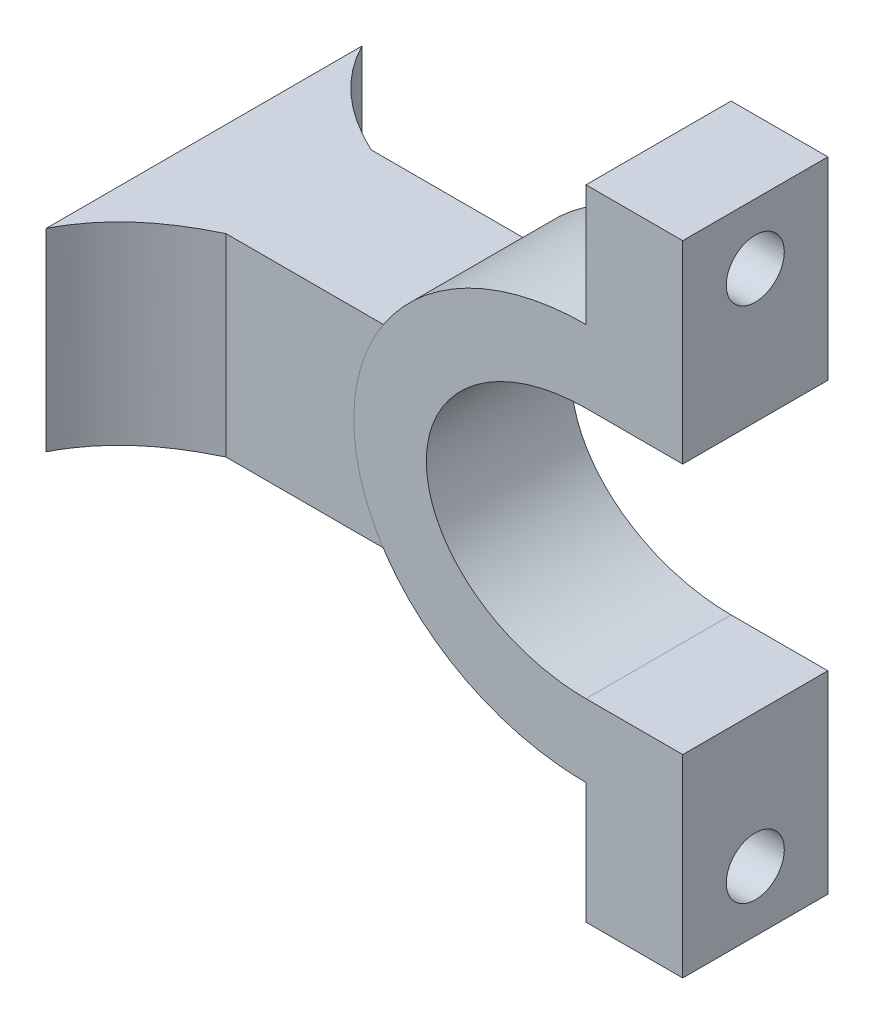
ISO-10303-21;
HEADER;
FILE_DESCRIPTION(('STEP AP214'),'2;1');
FILE_NAME('part.step','',(''),(''),'','','');
FILE_SCHEMA(('AUTOMOTIVE_DESIGN { 1 0 10303 214 1 1 1 1 }'));
ENDSEC;
DATA;
#1=APPLICATION_CONTEXT('core data for automotive mechanical design processes');
#2=APPLICATION_PROTOCOL_DEFINITION('international standard','automotive_design',2000,#1);
#3=PRODUCT_CONTEXT('',#1,'mechanical');
#4=PRODUCT('Part','Part','',(#3));
#5=PRODUCT_RELATED_PRODUCT_CATEGORY('part','',(#4));
#6=PRODUCT_DEFINITION_FORMATION('','',#4);
#7=PRODUCT_DEFINITION_CONTEXT('part definition',#1,'design');
#8=PRODUCT_DEFINITION('design','',#6,#7);
#9=PRODUCT_DEFINITION_SHAPE('','',#8);
#10=(LENGTH_UNIT() NAMED_UNIT(*) SI_UNIT(.MILLI.,.METRE.));
#11=(NAMED_UNIT(*) PLANE_ANGLE_UNIT() SI_UNIT($,.RADIAN.));
#12=(NAMED_UNIT(*) SI_UNIT($,.STERADIAN.) SOLID_ANGLE_UNIT());
#13=UNCERTAINTY_MEASURE_WITH_UNIT(LENGTH_MEASURE(1.E-05),#10,'distance_accuracy_value','');
#14=(GEOMETRIC_REPRESENTATION_CONTEXT(3) GLOBAL_UNCERTAINTY_ASSIGNED_CONTEXT((#13)) GLOBAL_UNIT_ASSIGNED_CONTEXT((#10,
#11,#12)) REPRESENTATION_CONTEXT('',''));
#15=CARTESIAN_POINT('',(0.,0.,0.));
#16=DIRECTION('',(0.,0.,1.));
#17=DIRECTION('',(1.,0.,0.));
#18=AXIS2_PLACEMENT_3D('',#15,#16,#17);
#19=CARTESIAN_POINT('',(-19.,9.99999999999999,-0.0273344769397017));
#20=DIRECTION('',(0.,0.,1.));
#21=DIRECTION('',(0.,-1.,0.));
#22=AXIS2_PLACEMENT_3D('',#19,#20,#21);
#23=PLANE('',#22);
#24=DIRECTION('',(0.,-1.,0.));
#25=VECTOR('',#24,1.);
#26=CARTESIAN_POINT('',(-37.2319884603769,9.99999999999999,-0.027334476939704));
#27=LINE('',#26,#25);
#28=CARTESIAN_POINT('',(-37.2319884603769,9.99999999999999,-0.0273344769397017));
#29=VERTEX_POINT('',#28);
#30=CARTESIAN_POINT('',(-37.2319884603769,-10.,-0.0273344769397063));
#31=VERTEX_POINT('',#30);
#32=EDGE_CURVE('E96',#29,#31,#27,.T.);
#33=ORIENTED_EDGE('',*,*,#32,.F.);
#34=DIRECTION('',(-1.,0.,0.));
#35=VECTOR('',#34,1.);
#36=CARTESIAN_POINT('',(-19.,9.99999999999999,-0.0273344769397017));
#37=LINE('',#36,#35);
#38=CARTESIAN_POINT('',(-19.,9.99999999999999,-0.0273344769397017));
#39=VERTEX_POINT('',#38);
#40=EDGE_CURVE('E378',#39,#29,#37,.T.);
#41=ORIENTED_EDGE('',*,*,#40,.F.);
#42=DIRECTION('',(0.,1.,0.));
#43=VECTOR('',#42,1.);
#44=CARTESIAN_POINT('',(-19.,9.99999999999999,-0.0273344769397017));
#45=LINE('',#44,#43);
#46=CARTESIAN_POINT('',(-19.,-10.,-0.0273344769397066));
#47=VERTEX_POINT('',#46);
#48=EDGE_CURVE('E369',#47,#39,#45,.T.);
#49=ORIENTED_EDGE('',*,*,#48,.F.);
#50=DIRECTION('',(-1.,0.,0.));
#51=VECTOR('',#50,1.);
#52=CARTESIAN_POINT('',(-19.,-10.,-0.0273344769397066));
#53=LINE('',#52,#51);
#54=EDGE_CURVE('E381',#47,#31,#53,.T.);
#55=ORIENTED_EDGE('',*,*,#54,.T.);
#56=EDGE_LOOP('',(#33,#41,#49,#55));
#57=FACE_BOUND('',#56,.T.);
#58=ADVANCED_FACE('F79',(#57),#23,.F.);
#59=CARTESIAN_POINT('',(0.,0.,15.));
#60=DIRECTION('',(0.,0.,1.));
#61=DIRECTION('',(1.,0.,0.));
#62=AXIS2_PLACEMENT_3D('',#59,#60,#61);
#63=ELLIPSE('',#62,24.,20.5);
#64=DIRECTION('',(0.,0.,-1.));
#65=VECTOR('',#64,1.);
#66=SURFACE_OF_LINEAR_EXTRUSION('',#63,#65);
#67=DIRECTION('',(0.,0.,-1.));
#68=VECTOR('',#67,1.);
#69=CARTESIAN_POINT('',(-20.9508645871297,-10.,15.));
#70=LINE('',#69,#68);
#71=CARTESIAN_POINT('',(-20.9508645871297,-10.,0.));
#72=VERTEX_POINT('',#71);
#73=CARTESIAN_POINT('',(-20.9508645871297,-10.,14.9726655230603));
#74=VERTEX_POINT('',#73);
#75=EDGE_CURVE('E392',#72,#74,#70,.F.);
#76=ORIENTED_EDGE('',*,*,#75,.F.);
#77=CARTESIAN_POINT('',(0.,0.,0.));
#78=DIRECTION('',(0.,0.,1.));
#79=DIRECTION('',(1.,0.,0.));
#80=AXIS2_PLACEMENT_3D('',#77,#78,#79);
#81=ELLIPSE('',#80,24.,20.5);
#82=CARTESIAN_POINT('',(0.,-20.5,0.));
#83=VERTEX_POINT('',#82);
#84=EDGE_CURVE('E395',#72,#83,#81,.T.);
#85=ORIENTED_EDGE('',*,*,#84,.T.);
#86=DIRECTION('',(0.,0.,-1.));
#87=VECTOR('',#86,1.);
#88=CARTESIAN_POINT('',(0.,-20.5,15.));
#89=LINE('',#88,#87);
#90=CARTESIAN_POINT('',(0.,-20.5,15.));
#91=VERTEX_POINT('',#90);
#92=EDGE_CURVE('E483',#91,#83,#89,.T.);
#93=ORIENTED_EDGE('',*,*,#92,.F.);
#94=CARTESIAN_POINT('',(0.,20.5,15.));
#95=VERTEX_POINT('',#94);
#96=EDGE_CURVE('E396',#95,#91,#63,.T.);
#97=ORIENTED_EDGE('',*,*,#96,.F.);
#98=DIRECTION('',(0.,0.,-1.));
#99=VECTOR('',#98,1.);
#100=CARTESIAN_POINT('',(0.,20.5,15.));
#101=LINE('',#100,#99);
#102=CARTESIAN_POINT('',(0.,20.5,0.));
#103=VERTEX_POINT('',#102);
#104=EDGE_CURVE('E490',#95,#103,#101,.T.);
#105=ORIENTED_EDGE('',*,*,#104,.T.);
#106=CARTESIAN_POINT('',(-20.9508645871297,9.99999999999999,0.));
#107=VERTEX_POINT('',#106);
#108=EDGE_CURVE('E407',#103,#107,#81,.T.);
#109=ORIENTED_EDGE('',*,*,#108,.T.);
#110=DIRECTION('',(0.,0.,-1.));
#111=VECTOR('',#110,1.);
#112=CARTESIAN_POINT('',(-20.9508645871297,9.99999999999999,15.));
#113=LINE('',#112,#111);
#114=CARTESIAN_POINT('',(-20.9508645871297,9.99999999999999,14.9726655230603));
#115=VERTEX_POINT('',#114);
#116=EDGE_CURVE('E388',#115,#107,#113,.T.);
#117=ORIENTED_EDGE('',*,*,#116,.F.);
#118=CARTESIAN_POINT('',(0.,0.,14.9726655230603));
#119=DIRECTION('',(0.,0.,1.));
#120=DIRECTION('',(1.,0.,0.));
#121=AXIS2_PLACEMENT_3D('',#118,#119,#120);
#122=ELLIPSE('',#121,24.,20.5);
#123=EDGE_CURVE('E12',#74,#115,#122,.F.);
#124=ORIENTED_EDGE('',*,*,#123,.F.);
#125=EDGE_LOOP('',(#76,#85,#93,#97,#105,#109,#117,#124));
#126=FACE_BOUND('',#125,.T.);
#127=ADVANCED_FACE('F81',(#126),#66,.F.);
#128=CARTESIAN_POINT('',(0.,0.,0.));
#129=DIRECTION('',(0.,0.,1.));
#130=DIRECTION('',(1.,0.,0.));
#131=AXIS2_PLACEMENT_3D('',#128,#129,#130);
#132=PLANE('',#131);
#133=DIRECTION('',(-1.,0.,0.));
#134=VECTOR('',#133,1.);
#135=CARTESIAN_POINT('',(0.,-10.,0.));
#136=LINE('',#135,#134);
#137=CARTESIAN_POINT('',(-19.,-10.,0.));
#138=VERTEX_POINT('',#137);
#139=EDGE_CURVE('E89',#138,#72,#136,.T.);
#140=ORIENTED_EDGE('',*,*,#139,.F.);
#141=DIRECTION('',(0.,-1.,0.));
#142=VECTOR('',#141,1.);
#143=CARTESIAN_POINT('',(-19.,0.,0.));
#144=LINE('',#143,#142);
#145=CARTESIAN_POINT('',(-19.,9.99999999999999,0.));
#146=VERTEX_POINT('',#145);
#147=EDGE_CURVE('E496',#146,#138,#144,.T.);
#148=ORIENTED_EDGE('',*,*,#147,.F.);
#149=DIRECTION('',(1.,0.,0.));
#150=VECTOR('',#149,1.);
#151=CARTESIAN_POINT('',(0.,9.99999999999999,0.));
#152=LINE('',#151,#150);
#153=EDGE_CURVE('E501',#107,#146,#152,.T.);
#154=ORIENTED_EDGE('',*,*,#153,.F.);
#155=ORIENTED_EDGE('',*,*,#108,.F.);
#156=DIRECTION('',(0.,1.,0.));
#157=VECTOR('',#156,1.);
#158=CARTESIAN_POINT('',(0.,13.,0.));
#159=LINE('',#158,#157);
#160=CARTESIAN_POINT('',(0.,33.,0.));
#161=VERTEX_POINT('',#160);
#162=EDGE_CURVE('E307',#103,#161,#159,.T.);
#163=ORIENTED_EDGE('',*,*,#162,.T.);
#164=DIRECTION('',(-1.,0.,0.));
#165=VECTOR('',#164,1.);
#166=CARTESIAN_POINT('',(10.,33.,0.));
#167=LINE('',#166,#165);
#168=CARTESIAN_POINT('',(10.,33.,0.));
#169=VERTEX_POINT('',#168);
#170=EDGE_CURVE('E316',#169,#161,#167,.T.);
#171=ORIENTED_EDGE('',*,*,#170,.F.);
#172=DIRECTION('',(0.,1.,0.));
#173=VECTOR('',#172,1.);
#174=CARTESIAN_POINT('',(10.,13.,0.));
#175=LINE('',#174,#173);
#176=CARTESIAN_POINT('',(10.,13.,0.));
#177=VERTEX_POINT('',#176);
#178=EDGE_CURVE('E296',#177,#169,#175,.T.);
#179=ORIENTED_EDGE('',*,*,#178,.F.);
#180=DIRECTION('',(-1.,0.,0.));
#181=VECTOR('',#180,1.);
#182=CARTESIAN_POINT('',(10.,13.,0.));
#183=LINE('',#182,#181);
#184=CARTESIAN_POINT('',(0.,13.,0.));
#185=VERTEX_POINT('',#184);
#186=EDGE_CURVE('E320',#177,#185,#183,.T.);
#187=ORIENTED_EDGE('',*,*,#186,.T.);
#188=CARTESIAN_POINT('',(0.,0.,0.));
#189=DIRECTION('',(0.,0.,1.));
#190=DIRECTION('',(1.,0.,0.));
#191=AXIS2_PLACEMENT_3D('',#188,#189,#190);
#192=ELLIPSE('',#191,16.5,13.);
#193=CARTESIAN_POINT('',(0.,-13.,0.));
#194=VERTEX_POINT('',#193);
#195=EDGE_CURVE('E402',#185,#194,#192,.T.);
#196=ORIENTED_EDGE('',*,*,#195,.T.);
#197=DIRECTION('',(-1.,0.,0.));
#198=VECTOR('',#197,1.);
#199=CARTESIAN_POINT('',(10.,-13.,0.));
#200=LINE('',#199,#198);
#201=CARTESIAN_POINT('',(10.,-13.,0.));
#202=VERTEX_POINT('',#201);
#203=EDGE_CURVE('E335',#202,#194,#200,.T.);
#204=ORIENTED_EDGE('',*,*,#203,.F.);
#205=DIRECTION('',(0.,1.,0.));
#206=VECTOR('',#205,1.);
#207=CARTESIAN_POINT('',(10.,-13.,0.));
#208=LINE('',#207,#206);
#209=CARTESIAN_POINT('',(10.,-33.,0.));
#210=VERTEX_POINT('',#209);
#211=EDGE_CURVE('E356',#210,#202,#208,.T.);
#212=ORIENTED_EDGE('',*,*,#211,.F.);
#213=DIRECTION('',(-1.,0.,0.));
#214=VECTOR('',#213,1.);
#215=CARTESIAN_POINT('',(10.,-33.,0.));
#216=LINE('',#215,#214);
#217=CARTESIAN_POINT('',(0.,-33.,0.));
#218=VERTEX_POINT('',#217);
#219=EDGE_CURVE('E331',#210,#218,#216,.T.);
#220=ORIENTED_EDGE('',*,*,#219,.T.);
#221=DIRECTION('',(0.,1.,0.));
#222=VECTOR('',#221,1.);
#223=CARTESIAN_POINT('',(0.,-13.,0.));
#224=LINE('',#223,#222);
#225=EDGE_CURVE('E344',#218,#83,#224,.T.);
#226=ORIENTED_EDGE('',*,*,#225,.T.);
#227=ORIENTED_EDGE('',*,*,#84,.F.);
#228=EDGE_LOOP('',(#140,#148,#154,#155,#163,#171,#179,#187,#196,#204,#212,#220,#226,#227));
#229=FACE_BOUND('',#228,.T.);
#230=ADVANCED_FACE('F413',(#229),#132,.F.);
#231=CARTESIAN_POINT('',(0.,0.,15.));
#232=DIRECTION('',(0.,0.,1.));
#233=DIRECTION('',(1.,0.,0.));
#234=AXIS2_PLACEMENT_3D('',#231,#232,#233);
#235=ELLIPSE('',#234,16.5,13.);
#236=DIRECTION('',(0.,0.,-1.));
#237=VECTOR('',#236,1.);
#238=SURFACE_OF_LINEAR_EXTRUSION('',#235,#237);
#239=ORIENTED_EDGE('',*,*,#195,.F.);
#240=DIRECTION('',(0.,0.,-1.));
#241=VECTOR('',#240,1.);
#242=CARTESIAN_POINT('',(0.,13.,15.));
#243=LINE('',#242,#241);
#244=CARTESIAN_POINT('',(0.,13.,15.));
#245=VERTEX_POINT('',#244);
#246=EDGE_CURVE('E406',#245,#185,#243,.T.);
#247=ORIENTED_EDGE('',*,*,#246,.F.);
#248=CARTESIAN_POINT('',(0.,-13.,15.));
#249=VERTEX_POINT('',#248);
#250=EDGE_CURVE('E401',#245,#249,#235,.T.);
#251=ORIENTED_EDGE('',*,*,#250,.T.);
#252=DIRECTION('',(0.,0.,-1.));
#253=VECTOR('',#252,1.);
#254=CARTESIAN_POINT('',(0.,-13.,15.));
#255=LINE('',#254,#253);
#256=EDGE_CURVE('E503',#249,#194,#255,.T.);
#257=ORIENTED_EDGE('',*,*,#256,.T.);
#258=EDGE_LOOP('',(#239,#247,#251,#257));
#259=FACE_BOUND('',#258,.T.);
#260=ADVANCED_FACE('F409',(#259),#238,.T.);
#261=CARTESIAN_POINT('',(0.,0.,15.));
#262=DIRECTION('',(0.,0.,1.));
#263=DIRECTION('',(1.,0.,0.));
#264=AXIS2_PLACEMENT_3D('',#261,#262,#263);
#265=PLANE('',#264);
#266=ORIENTED_EDGE('',*,*,#250,.F.);
#267=DIRECTION('',(-1.,0.,0.));
#268=VECTOR('',#267,1.);
#269=CARTESIAN_POINT('',(10.,13.,15.));
#270=LINE('',#269,#268);
#271=CARTESIAN_POINT('',(10.,13.,15.));
#272=VERTEX_POINT('',#271);
#273=EDGE_CURVE('E324',#272,#245,#270,.T.);
#274=ORIENTED_EDGE('',*,*,#273,.F.);
#275=DIRECTION('',(0.,-1.,0.));
#276=VECTOR('',#275,1.);
#277=CARTESIAN_POINT('',(10.,13.,15.));
#278=LINE('',#277,#276);
#279=CARTESIAN_POINT('',(10.,33.,15.));
#280=VERTEX_POINT('',#279);
#281=EDGE_CURVE('E288',#280,#272,#278,.T.);
#282=ORIENTED_EDGE('',*,*,#281,.F.);
#283=DIRECTION('',(-1.,0.,0.));
#284=VECTOR('',#283,1.);
#285=CARTESIAN_POINT('',(10.,33.,15.));
#286=LINE('',#285,#284);
#287=CARTESIAN_POINT('',(0.,33.,15.));
#288=VERTEX_POINT('',#287);
#289=EDGE_CURVE('E302',#280,#288,#286,.T.);
#290=ORIENTED_EDGE('',*,*,#289,.T.);
#291=DIRECTION('',(0.,-1.,0.));
#292=VECTOR('',#291,1.);
#293=CARTESIAN_POINT('',(0.,13.,15.));
#294=LINE('',#293,#292);
#295=EDGE_CURVE('E303',#288,#95,#294,.T.);
#296=ORIENTED_EDGE('',*,*,#295,.T.);
#297=ORIENTED_EDGE('',*,*,#96,.T.);
#298=DIRECTION('',(0.,-1.,0.));
#299=VECTOR('',#298,1.);
#300=CARTESIAN_POINT('',(0.,-13.,15.));
#301=LINE('',#300,#299);
#302=CARTESIAN_POINT('',(0.,-33.,15.));
#303=VERTEX_POINT('',#302);
#304=EDGE_CURVE('E308',#91,#303,#301,.T.);
#305=ORIENTED_EDGE('',*,*,#304,.T.);
#306=DIRECTION('',(-1.,0.,0.));
#307=VECTOR('',#306,1.);
#308=CARTESIAN_POINT('',(10.,-33.,15.));
#309=LINE('',#308,#307);
#310=CARTESIAN_POINT('',(10.,-33.,15.));
#311=VERTEX_POINT('',#310);
#312=EDGE_CURVE('E276',#311,#303,#309,.T.);
#313=ORIENTED_EDGE('',*,*,#312,.F.);
#314=DIRECTION('',(0.,-1.,0.));
#315=VECTOR('',#314,1.);
#316=CARTESIAN_POINT('',(10.,-13.,15.));
#317=LINE('',#316,#315);
#318=CARTESIAN_POINT('',(10.,-13.,15.));
#319=VERTEX_POINT('',#318);
#320=EDGE_CURVE('E349',#319,#311,#317,.T.);
#321=ORIENTED_EDGE('',*,*,#320,.F.);
#322=DIRECTION('',(-1.,0.,0.));
#323=VECTOR('',#322,1.);
#324=CARTESIAN_POINT('',(10.,-13.,15.));
#325=LINE('',#324,#323);
#326=EDGE_CURVE('E339',#319,#249,#325,.T.);
#327=ORIENTED_EDGE('',*,*,#326,.T.);
#328=EDGE_LOOP('',(#266,#274,#282,#290,#296,#297,#305,#313,#321,#327));
#329=FACE_BOUND('',#328,.T.);
#330=ADVANCED_FACE('F412',(#329),#265,.T.);
#331=CARTESIAN_POINT('',(-19.,-10.,-0.0273344769397066));
#332=DIRECTION('',(0.,1.,0.));
#333=DIRECTION('',(0.,0.,1.));
#334=AXIS2_PLACEMENT_3D('',#331,#332,#333);
#335=PLANE('',#334);
#336=ORIENTED_EDGE('',*,*,#139,.T.);
#337=ORIENTED_EDGE('',*,*,#75,.T.);
#338=DIRECTION('',(-1.,0.,0.));
#339=VECTOR('',#338,1.);
#340=CARTESIAN_POINT('',(-19.,-10.,14.9726655230603));
#341=LINE('',#340,#339);
#342=CARTESIAN_POINT('',(-37.2319884603769,-10.,14.9726655230603));
#343=VERTEX_POINT('',#342);
#344=EDGE_CURVE('E384',#74,#343,#341,.T.);
#345=ORIENTED_EDGE('',*,*,#344,.T.);
#346=CARTESIAN_POINT('',(-37.2319884603769,-10.,14.9726655230603));
#347=CARTESIAN_POINT('',(-40.110917996488,-10.,16.3725717447818));
#348=CARTESIAN_POINT('',(-44.4141664805553,-10.,18.7815693102138));
#349=CARTESIAN_POINT('',(-47.,-10.,23.7948089840785));
#350=B_SPLINE_CURVE_WITH_KNOTS('',3,(#346,#347,#348,#349),.UNSPECIFIED.,.F.,.F.,(4,4),(0.,1.),.UNSPECIFIED.);
#351=CARTESIAN_POINT('',(-47.,-10.,23.7948089840785));
#352=VERTEX_POINT('',#351);
#353=EDGE_CURVE('E233',#343,#352,#350,.T.);
#354=ORIENTED_EDGE('',*,*,#353,.T.);
#355=DIRECTION('',(0.,0.,-1.));
#356=VECTOR('',#355,1.);
#357=CARTESIAN_POINT('',(-47.,-10.,-0.0273344769397066));
#358=LINE('',#357,#356);
#359=CARTESIAN_POINT('',(-47.,-10.,-8.84947793795789));
#360=VERTEX_POINT('',#359);
#361=EDGE_CURVE('E219',#352,#360,#358,.T.);
#362=ORIENTED_EDGE('',*,*,#361,.T.);
#363=CARTESIAN_POINT('',(-47.,-10.,-8.84947793795789));
#364=CARTESIAN_POINT('',(-44.4141664805553,-10.,-3.83623826409321));
#365=CARTESIAN_POINT('',(-40.110917996488,-10.,-1.4272406986612));
#366=CARTESIAN_POINT('',(-37.2319884603769,-10.,-0.0273344769397063));
#367=B_SPLINE_CURVE_WITH_KNOTS('',3,(#363,#364,#365,#366),.UNSPECIFIED.,.F.,.F.,(4,4),(0.,1.),.UNSPECIFIED.);
#368=EDGE_CURVE('E238',#360,#31,#367,.T.);
#369=ORIENTED_EDGE('',*,*,#368,.T.);
#370=ORIENTED_EDGE('',*,*,#54,.F.);
#371=DIRECTION('',(0.,0.,-1.));
#372=VECTOR('',#371,1.);
#373=CARTESIAN_POINT('',(-19.,-10.,-0.0273344769397066));
#374=LINE('',#373,#372);
#375=EDGE_CURVE('E218',#138,#47,#374,.T.);
#376=ORIENTED_EDGE('',*,*,#375,.F.);
#377=EDGE_LOOP('',(#336,#337,#345,#354,#362,#369,#370,#376));
#378=FACE_BOUND('',#377,.T.);
#379=ADVANCED_FACE('F420',(#378),#335,.F.);
#380=CARTESIAN_POINT('',(-19.,9.99999999999999,-0.0273344769397017));
#381=DIRECTION('',(0.,-1.,0.));
#382=DIRECTION('',(0.,0.,-1.));
#383=AXIS2_PLACEMENT_3D('',#380,#381,#382);
#384=PLANE('',#383);
#385=DIRECTION('',(-1.,0.,0.));
#386=VECTOR('',#385,1.);
#387=CARTESIAN_POINT('',(-19.,9.99999999999999,14.9726655230603));
#388=LINE('',#387,#386);
#389=CARTESIAN_POINT('',(-37.2319884603769,9.99999999999999,14.9726655230603));
#390=VERTEX_POINT('',#389);
#391=EDGE_CURVE('E103',#115,#390,#388,.T.);
#392=ORIENTED_EDGE('',*,*,#391,.F.);
#393=ORIENTED_EDGE('',*,*,#116,.T.);
#394=ORIENTED_EDGE('',*,*,#153,.T.);
#395=DIRECTION('',(0.,0.,1.));
#396=VECTOR('',#395,1.);
#397=CARTESIAN_POINT('',(-19.,9.99999999999999,-0.0273344769397017));
#398=LINE('',#397,#396);
#399=EDGE_CURVE('E372',#39,#146,#398,.T.);
#400=ORIENTED_EDGE('',*,*,#399,.F.);
#401=ORIENTED_EDGE('',*,*,#40,.T.);
#402=CARTESIAN_POINT('',(-47.,9.99999999999999,-8.84947793795789));
#403=CARTESIAN_POINT('',(-44.4141664805553,9.99999999999999,-3.8362382640932));
#404=CARTESIAN_POINT('',(-40.110917996488,9.99999999999999,-1.4272406986612));
#405=CARTESIAN_POINT('',(-37.2319884603769,9.99999999999999,-0.027334476939704));
#406=B_SPLINE_CURVE_WITH_KNOTS('',3,(#402,#403,#404,#405),.UNSPECIFIED.,.F.,.F.,(4,4),(0.,1.),.UNSPECIFIED.);
#407=CARTESIAN_POINT('',(-47.,9.99999999999999,-8.84947793795789));
#408=VERTEX_POINT('',#407);
#409=EDGE_CURVE('E213',#408,#29,#406,.T.);
#410=ORIENTED_EDGE('',*,*,#409,.F.);
#411=DIRECTION('',(0.,0.,1.));
#412=VECTOR('',#411,1.);
#413=CARTESIAN_POINT('',(-47.,9.99999999999999,-0.0273344769397017));
#414=LINE('',#413,#412);
#415=CARTESIAN_POINT('',(-47.,9.99999999999999,23.7948089840785));
#416=VERTEX_POINT('',#415);
#417=EDGE_CURVE('E207',#408,#416,#414,.T.);
#418=ORIENTED_EDGE('',*,*,#417,.T.);
#419=CARTESIAN_POINT('',(-37.2319884603769,9.99999999999999,14.9726655230603));
#420=CARTESIAN_POINT('',(-40.110917996488,9.99999999999999,16.3725717447818));
#421=CARTESIAN_POINT('',(-44.4141664805553,9.99999999999999,18.7815693102138));
#422=CARTESIAN_POINT('',(-47.,9.99999999999999,23.7948089840785));
#423=B_SPLINE_CURVE_WITH_KNOTS('',3,(#419,#420,#421,#422),.UNSPECIFIED.,.F.,.F.,(4,4),(0.,1.),.UNSPECIFIED.);
#424=EDGE_CURVE('E211',#390,#416,#423,.T.);
#425=ORIENTED_EDGE('',*,*,#424,.F.);
#426=EDGE_LOOP('',(#392,#393,#394,#400,#401,#410,#418,#425));
#427=FACE_BOUND('',#426,.T.);
#428=ADVANCED_FACE('F209',(#427),#384,.F.);
#429=CARTESIAN_POINT('',(-19.,0.,0.));
#430=DIRECTION('',(-1.,0.,0.));
#431=DIRECTION('',(0.,0.,1.));
#432=AXIS2_PLACEMENT_3D('',#429,#430,#431);
#433=PLANE('',#432);
#434=ORIENTED_EDGE('',*,*,#399,.T.);
#435=ORIENTED_EDGE('',*,*,#147,.T.);
#436=ORIENTED_EDGE('',*,*,#375,.T.);
#437=ORIENTED_EDGE('',*,*,#48,.T.);
#438=EDGE_LOOP('',(#434,#435,#436,#437));
#439=FACE_BOUND('',#438,.T.);
#440=ADVANCED_FACE('F425',(#439),#433,.F.);
#441=CARTESIAN_POINT('',(-19.,9.99999999999999,14.9726655230603));
#442=DIRECTION('',(0.,0.,-1.));
#443=DIRECTION('',(0.,1.,0.));
#444=AXIS2_PLACEMENT_3D('',#441,#442,#443);
#445=PLANE('',#444);
#446=ORIENTED_EDGE('',*,*,#391,.T.);
#447=DIRECTION('',(0.,-1.,0.));
#448=VECTOR('',#447,1.);
#449=CARTESIAN_POINT('',(-37.2319884603769,9.99999999999999,14.9726655230603));
#450=LINE('',#449,#448);
#451=EDGE_CURVE('E229',#390,#343,#450,.T.);
#452=ORIENTED_EDGE('',*,*,#451,.T.);
#453=ORIENTED_EDGE('',*,*,#344,.F.);
#454=ORIENTED_EDGE('',*,*,#123,.T.);
#455=EDGE_LOOP('',(#446,#452,#453,#454));
#456=FACE_BOUND('',#455,.T.);
#457=ADVANCED_FACE('F422',(#456),#445,.F.);
#458=CARTESIAN_POINT('',(-47.,0.,0.));
#459=DIRECTION('',(-1.,0.,0.));
#460=DIRECTION('',(0.,0.,1.));
#461=AXIS2_PLACEMENT_3D('',#458,#459,#460);
#462=PLANE('',#461);
#463=ORIENTED_EDGE('',*,*,#361,.F.);
#464=DIRECTION('',(0.,-1.,0.));
#465=VECTOR('',#464,1.);
#466=CARTESIAN_POINT('',(-47.,9.99999999999999,23.7948089840785));
#467=LINE('',#466,#465);
#468=EDGE_CURVE('E222',#416,#352,#467,.T.);
#469=ORIENTED_EDGE('',*,*,#468,.F.);
#470=ORIENTED_EDGE('',*,*,#417,.F.);
#471=DIRECTION('',(0.,-1.,0.));
#472=VECTOR('',#471,1.);
#473=CARTESIAN_POINT('',(-47.,9.99999999999999,-8.84947793795789));
#474=LINE('',#473,#472);
#475=EDGE_CURVE('E265',#408,#360,#474,.T.);
#476=ORIENTED_EDGE('',*,*,#475,.T.);
#477=EDGE_LOOP('',(#463,#469,#470,#476));
#478=FACE_BOUND('',#477,.T.);
#479=ADVANCED_FACE('F223',(#478),#462,.T.);
#480=CARTESIAN_POINT('',(0.,0.,0.));
#481=DIRECTION('',(1.,0.,0.));
#482=DIRECTION('',(0.,1.,0.));
#483=AXIS2_PLACEMENT_3D('',#480,#481,#482);
#484=PLANE('',#483);
#485=CARTESIAN_POINT('',(0.,-26.75,7.49999999999996));
#486=DIRECTION('',(-1.,0.,0.));
#487=DIRECTION('',(0.,1.,0.));
#488=AXIS2_PLACEMENT_3D('',#485,#486,#487);
#489=CIRCLE('',#488,3.);
#490=CARTESIAN_POINT('',(0.,-23.75,7.49999999999996));
#491=VERTEX_POINT('',#490);
#492=EDGE_CURVE('E281',#491,#491,#489,.T.);
#493=ORIENTED_EDGE('',*,*,#492,.F.);
#494=EDGE_LOOP('',(#493));
#495=FACE_BOUND('',#494,.T.);
#496=ORIENTED_EDGE('',*,*,#304,.F.);
#497=ORIENTED_EDGE('',*,*,#92,.T.);
#498=ORIENTED_EDGE('',*,*,#225,.F.);
#499=DIRECTION('',(0.,0.,-1.));
#500=VECTOR('',#499,1.);
#501=CARTESIAN_POINT('',(0.,-33.,15.));
#502=LINE('',#501,#500);
#503=EDGE_CURVE('E348',#303,#218,#502,.T.);
#504=ORIENTED_EDGE('',*,*,#503,.F.);
#505=EDGE_LOOP('',(#496,#497,#498,#504));
#506=FACE_BOUND('',#505,.T.);
#507=ADVANCED_FACE('F438',(#495,#506),#484,.F.);
#508=CARTESIAN_POINT('',(10.,-33.,15.));
#509=DIRECTION('',(0.,1.,0.));
#510=DIRECTION('',(0.,0.,1.));
#511=AXIS2_PLACEMENT_3D('',#508,#509,#510);
#512=PLANE('',#511);
#513=ORIENTED_EDGE('',*,*,#503,.T.);
#514=ORIENTED_EDGE('',*,*,#219,.F.);
#515=DIRECTION('',(0.,0.,-1.));
#516=VECTOR('',#515,1.);
#517=CARTESIAN_POINT('',(10.,-33.,15.));
#518=LINE('',#517,#516);
#519=EDGE_CURVE('E359',#311,#210,#518,.T.);
#520=ORIENTED_EDGE('',*,*,#519,.F.);
#521=ORIENTED_EDGE('',*,*,#312,.T.);
#522=EDGE_LOOP('',(#513,#514,#520,#521));
#523=FACE_BOUND('',#522,.T.);
#524=ADVANCED_FACE('F447',(#523),#512,.F.);
#525=CARTESIAN_POINT('',(10.,-13.,15.));
#526=DIRECTION('',(0.,-1.,0.));
#527=DIRECTION('',(0.,0.,-1.));
#528=AXIS2_PLACEMENT_3D('',#525,#526,#527);
#529=PLANE('',#528);
#530=ORIENTED_EDGE('',*,*,#256,.F.);
#531=ORIENTED_EDGE('',*,*,#326,.F.);
#532=DIRECTION('',(0.,0.,1.));
#533=VECTOR('',#532,1.);
#534=CARTESIAN_POINT('',(10.,-13.,15.));
#535=LINE('',#534,#533);
#536=EDGE_CURVE('E343',#202,#319,#535,.T.);
#537=ORIENTED_EDGE('',*,*,#536,.F.);
#538=ORIENTED_EDGE('',*,*,#203,.T.);
#539=EDGE_LOOP('',(#530,#531,#537,#538));
#540=FACE_BOUND('',#539,.T.);
#541=ADVANCED_FACE('F443',(#540),#529,.F.);
#542=CARTESIAN_POINT('',(10.,0.,0.));
#543=DIRECTION('',(1.,0.,0.));
#544=DIRECTION('',(0.,1.,0.));
#545=AXIS2_PLACEMENT_3D('',#542,#543,#544);
#546=PLANE('',#545);
#547=CARTESIAN_POINT('',(10.,-26.75,7.49999999999996));
#548=DIRECTION('',(-1.,0.,0.));
#549=DIRECTION('',(0.,1.,0.));
#550=AXIS2_PLACEMENT_3D('',#547,#548,#549);
#551=CIRCLE('',#550,3.);
#552=CARTESIAN_POINT('',(10.,-23.75,7.49999999999996));
#553=VERTEX_POINT('',#552);
#554=EDGE_CURVE('E228',#553,#553,#551,.T.);
#555=ORIENTED_EDGE('',*,*,#554,.T.);
#556=EDGE_LOOP('',(#555));
#557=FACE_BOUND('',#556,.T.);
#558=ORIENTED_EDGE('',*,*,#320,.T.);
#559=ORIENTED_EDGE('',*,*,#519,.T.);
#560=ORIENTED_EDGE('',*,*,#211,.T.);
#561=ORIENTED_EDGE('',*,*,#536,.T.);
#562=EDGE_LOOP('',(#558,#559,#560,#561));
#563=FACE_BOUND('',#562,.T.);
#564=ADVANCED_FACE('F439',(#557,#563),#546,.T.);
#565=CARTESIAN_POINT('',(0.,0.,0.));
#566=DIRECTION('',(-1.,0.,0.));
#567=DIRECTION('',(0.,-1.,0.));
#568=AXIS2_PLACEMENT_3D('',#565,#566,#567);
#569=PLANE('',#568);
#570=CARTESIAN_POINT('',(0.,26.75,7.5));
#571=DIRECTION('',(-1.,0.,0.));
#572=DIRECTION('',(0.,-1.,0.));
#573=AXIS2_PLACEMENT_3D('',#570,#571,#572);
#574=CIRCLE('',#573,3.);
#575=CARTESIAN_POINT('',(0.,23.75,7.5));
#576=VERTEX_POINT('',#575);
#577=EDGE_CURVE('E277',#576,#576,#574,.T.);
#578=ORIENTED_EDGE('',*,*,#577,.F.);
#579=EDGE_LOOP('',(#578));
#580=FACE_BOUND('',#579,.T.);
#581=ORIENTED_EDGE('',*,*,#104,.F.);
#582=ORIENTED_EDGE('',*,*,#295,.F.);
#583=DIRECTION('',(0.,0.,1.));
#584=VECTOR('',#583,1.);
#585=CARTESIAN_POINT('',(0.,33.,15.));
#586=LINE('',#585,#584);
#587=EDGE_CURVE('E293',#161,#288,#586,.T.);
#588=ORIENTED_EDGE('',*,*,#587,.F.);
#589=ORIENTED_EDGE('',*,*,#162,.F.);
#590=EDGE_LOOP('',(#581,#582,#588,#589));
#591=FACE_BOUND('',#590,.T.);
#592=ADVANCED_FACE('F442',(#580,#591),#569,.T.);
#593=CARTESIAN_POINT('',(10.,13.,15.));
#594=DIRECTION('',(0.,1.,0.));
#595=DIRECTION('',(-1.,0.,0.));
#596=AXIS2_PLACEMENT_3D('',#593,#594,#595);
#597=PLANE('',#596);
#598=ORIENTED_EDGE('',*,*,#246,.T.);
#599=ORIENTED_EDGE('',*,*,#186,.F.);
#600=DIRECTION('',(0.,0.,-1.));
#601=VECTOR('',#600,1.);
#602=CARTESIAN_POINT('',(10.,13.,15.));
#603=LINE('',#602,#601);
#604=EDGE_CURVE('E292',#272,#177,#603,.T.);
#605=ORIENTED_EDGE('',*,*,#604,.F.);
#606=ORIENTED_EDGE('',*,*,#273,.T.);
#607=EDGE_LOOP('',(#598,#599,#605,#606));
#608=FACE_BOUND('',#607,.T.);
#609=ADVANCED_FACE('F455',(#608),#597,.F.);
#610=CARTESIAN_POINT('',(10.,33.,15.));
#611=DIRECTION('',(0.,-1.,0.));
#612=DIRECTION('',(1.,0.,0.));
#613=AXIS2_PLACEMENT_3D('',#610,#611,#612);
#614=PLANE('',#613);
#615=ORIENTED_EDGE('',*,*,#587,.T.);
#616=ORIENTED_EDGE('',*,*,#289,.F.);
#617=DIRECTION('',(0.,0.,1.));
#618=VECTOR('',#617,1.);
#619=CARTESIAN_POINT('',(10.,33.,15.));
#620=LINE('',#619,#618);
#621=EDGE_CURVE('E299',#169,#280,#620,.T.);
#622=ORIENTED_EDGE('',*,*,#621,.F.);
#623=ORIENTED_EDGE('',*,*,#170,.T.);
#624=EDGE_LOOP('',(#615,#616,#622,#623));
#625=FACE_BOUND('',#624,.T.);
#626=ADVANCED_FACE('F458',(#625),#614,.F.);
#627=CARTESIAN_POINT('',(10.,0.,0.));
#628=DIRECTION('',(-1.,0.,0.));
#629=DIRECTION('',(0.,-1.,0.));
#630=AXIS2_PLACEMENT_3D('',#627,#628,#629);
#631=PLANE('',#630);
#632=CARTESIAN_POINT('',(10.,26.75,7.5));
#633=DIRECTION('',(-1.,0.,0.));
#634=DIRECTION('',(0.,-1.,0.));
#635=AXIS2_PLACEMENT_3D('',#632,#633,#634);
#636=CIRCLE('',#635,3.);
#637=CARTESIAN_POINT('',(10.,23.75,7.5));
#638=VERTEX_POINT('',#637);
#639=EDGE_CURVE('E269',#638,#638,#636,.T.);
#640=ORIENTED_EDGE('',*,*,#639,.T.);
#641=EDGE_LOOP('',(#640));
#642=FACE_BOUND('',#641,.T.);
#643=ORIENTED_EDGE('',*,*,#281,.T.);
#644=ORIENTED_EDGE('',*,*,#604,.T.);
#645=ORIENTED_EDGE('',*,*,#178,.T.);
#646=ORIENTED_EDGE('',*,*,#621,.T.);
#647=EDGE_LOOP('',(#643,#644,#645,#646));
#648=FACE_BOUND('',#647,.T.);
#649=ADVANCED_FACE('F462',(#642,#648),#631,.F.);
#650=CARTESIAN_POINT('',(10.,26.75,7.5));
#651=DIRECTION('',(-1.,0.,0.));
#652=DIRECTION('',(0.,-1.,0.));
#653=AXIS2_PLACEMENT_3D('',#650,#651,#652);
#654=CYLINDRICAL_SURFACE('',#653,3.);
#655=ORIENTED_EDGE('',*,*,#639,.F.);
#656=EDGE_LOOP('',(#655));
#657=FACE_BOUND('',#656,.T.);
#658=ORIENTED_EDGE('',*,*,#577,.T.);
#659=EDGE_LOOP('',(#658));
#660=FACE_BOUND('',#659,.T.);
#661=ADVANCED_FACE('F257',(#657,#660),#654,.F.);
#662=CARTESIAN_POINT('',(10.,-26.75,7.49999999999996));
#663=DIRECTION('',(-1.,0.,0.));
#664=DIRECTION('',(0.,-1.,0.));
#665=AXIS2_PLACEMENT_3D('',#662,#663,#664);
#666=CYLINDRICAL_SURFACE('',#665,3.);
#667=ORIENTED_EDGE('',*,*,#554,.F.);
#668=EDGE_LOOP('',(#667));
#669=FACE_BOUND('',#668,.T.);
#670=ORIENTED_EDGE('',*,*,#492,.T.);
#671=EDGE_LOOP('',(#670));
#672=FACE_BOUND('',#671,.T.);
#673=ADVANCED_FACE('F252',(#669,#672),#666,.F.);
#674=DIRECTION('',(0.,-1.,0.));
#675=VECTOR('',#674,1.);
#676=SURFACE_OF_LINEAR_EXTRUSION('',#423,#675);
#677=ORIENTED_EDGE('',*,*,#353,.F.);
#678=ORIENTED_EDGE('',*,*,#451,.F.);
#679=ORIENTED_EDGE('',*,*,#424,.T.);
#680=ORIENTED_EDGE('',*,*,#468,.T.);
#681=EDGE_LOOP('',(#677,#678,#679,#680));
#682=FACE_BOUND('',#681,.T.);
#683=ADVANCED_FACE('F231',(#682),#676,.T.);
#684=DIRECTION('',(0.,-1.,0.));
#685=VECTOR('',#684,1.);
#686=SURFACE_OF_LINEAR_EXTRUSION('',#406,#685);
#687=ORIENTED_EDGE('',*,*,#368,.F.);
#688=ORIENTED_EDGE('',*,*,#475,.F.);
#689=ORIENTED_EDGE('',*,*,#409,.T.);
#690=ORIENTED_EDGE('',*,*,#32,.T.);
#691=EDGE_LOOP('',(#687,#688,#689,#690));
#692=FACE_BOUND('',#691,.T.);
#693=ADVANCED_FACE('F251',(#692),#686,.T.);
#694=CLOSED_SHELL('',(#58,#127,#230,#260,#330,#379,#428,#440,#457,#479,#507,#524,#541,#564,#592,
#609,#626,#649,#661,#673,#683,#693));
#695=MANIFOLD_SOLID_BREP('B2',#694);
#696=ADVANCED_BREP_SHAPE_REPRESENTATION('',(#18,#695),#14);
#697=SHAPE_DEFINITION_REPRESENTATION(#9,#696);
ENDSEC;
END-ISO-10303-21;
